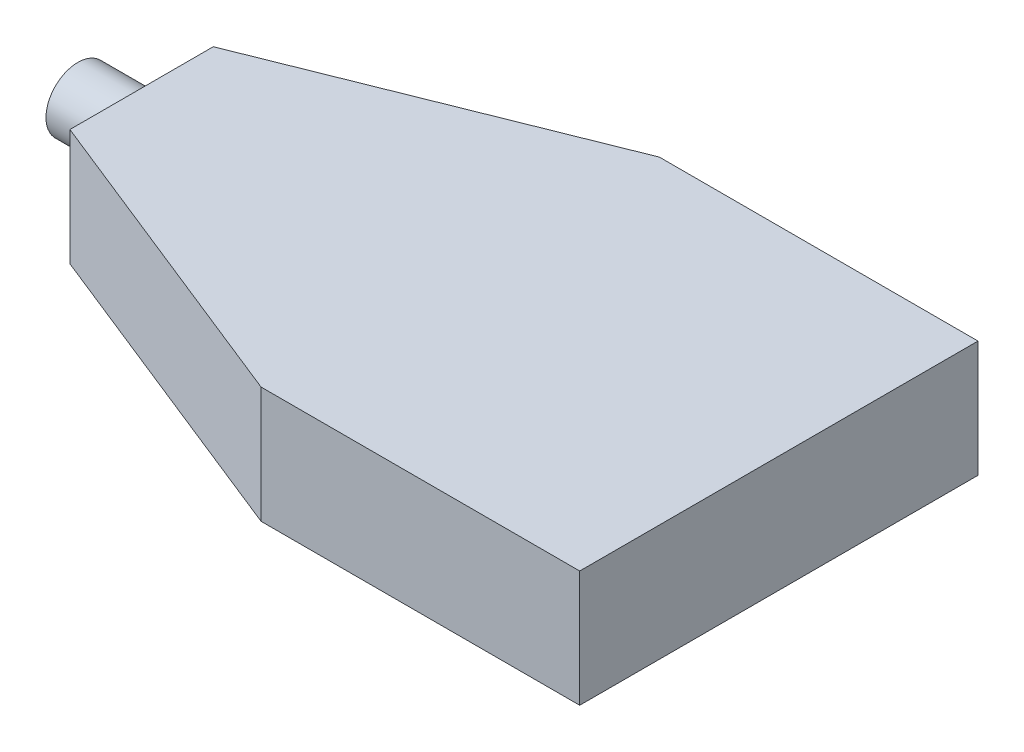
ISO-10303-21;
HEADER;
FILE_DESCRIPTION(('STEP AP214'),'2;1');
FILE_NAME('part.step','',(''),(''),'','','');
FILE_SCHEMA(('AUTOMOTIVE_DESIGN { 1 0 10303 214 1 1 1 1 }'));
ENDSEC;
DATA;
#1=APPLICATION_CONTEXT('core data for automotive mechanical design processes');
#2=APPLICATION_PROTOCOL_DEFINITION('international standard','automotive_design',2000,#1);
#3=PRODUCT_CONTEXT('',#1,'mechanical');
#4=PRODUCT('Part','Part','',(#3));
#5=PRODUCT_RELATED_PRODUCT_CATEGORY('part','',(#4));
#6=PRODUCT_DEFINITION_FORMATION('','',#4);
#7=PRODUCT_DEFINITION_CONTEXT('part definition',#1,'design');
#8=PRODUCT_DEFINITION('design','',#6,#7);
#9=PRODUCT_DEFINITION_SHAPE('','',#8);
#10=(LENGTH_UNIT() NAMED_UNIT(*) SI_UNIT(.MILLI.,.METRE.));
#11=(NAMED_UNIT(*) PLANE_ANGLE_UNIT() SI_UNIT($,.RADIAN.));
#12=(NAMED_UNIT(*) SI_UNIT($,.STERADIAN.) SOLID_ANGLE_UNIT());
#13=UNCERTAINTY_MEASURE_WITH_UNIT(LENGTH_MEASURE(1.E-05),#10,'distance_accuracy_value','');
#14=(GEOMETRIC_REPRESENTATION_CONTEXT(3) GLOBAL_UNCERTAINTY_ASSIGNED_CONTEXT((#13)) GLOBAL_UNIT_ASSIGNED_CONTEXT((#10,
#11,#12)) REPRESENTATION_CONTEXT('',''));
#15=CARTESIAN_POINT('',(0.,0.,0.));
#16=DIRECTION('',(0.,0.,1.));
#17=DIRECTION('',(1.,0.,0.));
#18=AXIS2_PLACEMENT_3D('',#15,#16,#17);
#19=CARTESIAN_POINT('',(-150.,36.5,0.));
#20=DIRECTION('',(1.,0.,0.));
#21=DIRECTION('',(0.,0.,-1.));
#22=AXIS2_PLACEMENT_3D('',#19,#20,#21);
#23=PLANE('',#22);
#24=CARTESIAN_POINT('',(-150.,23.5,0.));
#25=DIRECTION('',(-1.,0.,0.));
#26=DIRECTION('',(0.,0.,1.));
#27=AXIS2_PLACEMENT_3D('',#24,#25,#26);
#28=CIRCLE('',#27,10.);
#29=CARTESIAN_POINT('',(-150.,23.5,10.));
#30=VERTEX_POINT('',#29);
#31=EDGE_CURVE('E11',#30,#30,#28,.T.);
#32=ORIENTED_EDGE('',*,*,#31,.F.);
#33=EDGE_LOOP('',(#32));
#34=FACE_BOUND('',#33,.T.);
#35=DIRECTION('',(0.,0.,1.));
#36=VECTOR('',#35,1.);
#37=CARTESIAN_POINT('',(-150.,0.,0.));
#38=LINE('',#37,#36);
#39=CARTESIAN_POINT('',(-150.,0.,-22.5));
#40=VERTEX_POINT('',#39);
#41=CARTESIAN_POINT('',(-150.,0.,22.5));
#42=VERTEX_POINT('',#41);
#43=EDGE_CURVE('E127',#40,#42,#38,.T.);
#44=ORIENTED_EDGE('',*,*,#43,.T.);
#45=DIRECTION('',(0.,-1.,0.));
#46=VECTOR('',#45,1.);
#47=CARTESIAN_POINT('',(-150.,36.5,22.5));
#48=LINE('',#47,#46);
#49=CARTESIAN_POINT('',(-150.,36.5,22.5));
#50=VERTEX_POINT('',#49);
#51=EDGE_CURVE('E43',#50,#42,#48,.T.);
#52=ORIENTED_EDGE('',*,*,#51,.F.);
#53=DIRECTION('',(0.,0.,1.));
#54=VECTOR('',#53,1.);
#55=CARTESIAN_POINT('',(-150.,36.5,0.));
#56=LINE('',#55,#54);
#57=CARTESIAN_POINT('',(-150.,36.5,-22.5));
#58=VERTEX_POINT('',#57);
#59=EDGE_CURVE('E140',#58,#50,#56,.T.);
#60=ORIENTED_EDGE('',*,*,#59,.F.);
#61=DIRECTION('',(0.,-1.,0.));
#62=VECTOR('',#61,1.);
#63=CARTESIAN_POINT('',(-150.,36.5,-22.5));
#64=LINE('',#63,#62);
#65=EDGE_CURVE('E57',#58,#40,#64,.T.);
#66=ORIENTED_EDGE('',*,*,#65,.T.);
#67=EDGE_LOOP('',(#44,#52,#60,#66));
#68=FACE_BOUND('',#67,.T.);
#69=ADVANCED_FACE('F40',(#34,#68),#23,.F.);
#70=CARTESIAN_POINT('',(-28.4482758620689,36.5,71.1206896551724));
#71=DIRECTION('',(0.371390676354103,0.,-0.92847669088526));
#72=DIRECTION('',(-0.92847669088526,0.,-0.371390676354103));
#73=AXIS2_PLACEMENT_3D('',#70,#71,#72);
#74=PLANE('',#73);
#75=DIRECTION('',(0.92847669088526,0.,0.371390676354103));
#76=VECTOR('',#75,1.);
#77=CARTESIAN_POINT('',(-28.4482758620689,0.,71.1206896551724));
#78=LINE('',#77,#76);
#79=CARTESIAN_POINT('',(-50.,0.,62.5));
#80=VERTEX_POINT('',#79);
#81=EDGE_CURVE('E129',#42,#80,#78,.T.);
#82=ORIENTED_EDGE('',*,*,#81,.T.);
#83=DIRECTION('',(0.,-1.,0.));
#84=VECTOR('',#83,1.);
#85=CARTESIAN_POINT('',(-50.,36.5,62.5));
#86=LINE('',#85,#84);
#87=CARTESIAN_POINT('',(-50.,36.5,62.5));
#88=VERTEX_POINT('',#87);
#89=EDGE_CURVE('E143',#88,#80,#86,.T.);
#90=ORIENTED_EDGE('',*,*,#89,.F.);
#91=DIRECTION('',(0.92847669088526,0.,0.371390676354103));
#92=VECTOR('',#91,1.);
#93=CARTESIAN_POINT('',(-28.4482758620689,36.5,71.1206896551724));
#94=LINE('',#93,#92);
#95=EDGE_CURVE('E90',#50,#88,#94,.T.);
#96=ORIENTED_EDGE('',*,*,#95,.F.);
#97=ORIENTED_EDGE('',*,*,#51,.T.);
#98=EDGE_LOOP('',(#82,#90,#96,#97));
#99=FACE_BOUND('',#98,.T.);
#100=ADVANCED_FACE('F148',(#99),#74,.F.);
#101=CARTESIAN_POINT('',(0.,36.5,62.5));
#102=DIRECTION('',(0.,0.,-1.));
#103=DIRECTION('',(-1.,0.,0.));
#104=AXIS2_PLACEMENT_3D('',#101,#102,#103);
#105=PLANE('',#104);
#106=DIRECTION('',(1.,0.,0.));
#107=VECTOR('',#106,1.);
#108=CARTESIAN_POINT('',(0.,0.,62.5));
#109=LINE('',#108,#107);
#110=CARTESIAN_POINT('',(50.,0.,62.5));
#111=VERTEX_POINT('',#110);
#112=EDGE_CURVE('E132',#80,#111,#109,.T.);
#113=ORIENTED_EDGE('',*,*,#112,.T.);
#114=DIRECTION('',(0.,-1.,0.));
#115=VECTOR('',#114,1.);
#116=CARTESIAN_POINT('',(50.,36.5,62.5));
#117=LINE('',#116,#115);
#118=CARTESIAN_POINT('',(50.,36.5,62.5));
#119=VERTEX_POINT('',#118);
#120=EDGE_CURVE('E119',#119,#111,#117,.T.);
#121=ORIENTED_EDGE('',*,*,#120,.F.);
#122=DIRECTION('',(1.,0.,0.));
#123=VECTOR('',#122,1.);
#124=CARTESIAN_POINT('',(0.,36.5,62.5));
#125=LINE('',#124,#123);
#126=EDGE_CURVE('E107',#88,#119,#125,.T.);
#127=ORIENTED_EDGE('',*,*,#126,.F.);
#128=ORIENTED_EDGE('',*,*,#89,.T.);
#129=EDGE_LOOP('',(#113,#121,#127,#128));
#130=FACE_BOUND('',#129,.T.);
#131=ADVANCED_FACE('F166',(#130),#105,.F.);
#132=CARTESIAN_POINT('',(50.,36.5,0.));
#133=DIRECTION('',(-1.,0.,0.));
#134=DIRECTION('',(0.,0.,1.));
#135=AXIS2_PLACEMENT_3D('',#132,#133,#134);
#136=PLANE('',#135);
#137=DIRECTION('',(0.,0.,-1.));
#138=VECTOR('',#137,1.);
#139=CARTESIAN_POINT('',(50.,0.,0.));
#140=LINE('',#139,#138);
#141=CARTESIAN_POINT('',(50.,0.,-62.5));
#142=VERTEX_POINT('',#141);
#143=EDGE_CURVE('E116',#111,#142,#140,.T.);
#144=ORIENTED_EDGE('',*,*,#143,.T.);
#145=DIRECTION('',(0.,-1.,0.));
#146=VECTOR('',#145,1.);
#147=CARTESIAN_POINT('',(50.,36.5,-62.5));
#148=LINE('',#147,#146);
#149=CARTESIAN_POINT('',(50.,36.5,-62.5));
#150=VERTEX_POINT('',#149);
#151=EDGE_CURVE('E113',#150,#142,#148,.T.);
#152=ORIENTED_EDGE('',*,*,#151,.F.);
#153=DIRECTION('',(0.,0.,-1.));
#154=VECTOR('',#153,1.);
#155=CARTESIAN_POINT('',(50.,36.5,0.));
#156=LINE('',#155,#154);
#157=EDGE_CURVE('E100',#119,#150,#156,.T.);
#158=ORIENTED_EDGE('',*,*,#157,.F.);
#159=ORIENTED_EDGE('',*,*,#120,.T.);
#160=EDGE_LOOP('',(#144,#152,#158,#159));
#161=FACE_BOUND('',#160,.T.);
#162=ADVANCED_FACE('F114',(#161),#136,.F.);
#163=CARTESIAN_POINT('',(0.,36.5,-62.5));
#164=DIRECTION('',(0.,0.,-1.));
#165=DIRECTION('',(-1.,0.,0.));
#166=AXIS2_PLACEMENT_3D('',#163,#164,#165);
#167=PLANE('',#166);
#168=DIRECTION('',(1.,0.,0.));
#169=VECTOR('',#168,1.);
#170=CARTESIAN_POINT('',(0.,0.,-62.5));
#171=LINE('',#170,#169);
#172=CARTESIAN_POINT('',(-50.,0.,-62.5));
#173=VERTEX_POINT('',#172);
#174=EDGE_CURVE('E135',#173,#142,#171,.T.);
#175=ORIENTED_EDGE('',*,*,#174,.F.);
#176=DIRECTION('',(0.,-1.,0.));
#177=VECTOR('',#176,1.);
#178=CARTESIAN_POINT('',(-50.,36.5,-62.5));
#179=LINE('',#178,#177);
#180=CARTESIAN_POINT('',(-50.,36.5,-62.5));
#181=VERTEX_POINT('',#180);
#182=EDGE_CURVE('E77',#181,#173,#179,.T.);
#183=ORIENTED_EDGE('',*,*,#182,.F.);
#184=DIRECTION('',(1.,0.,0.));
#185=VECTOR('',#184,1.);
#186=CARTESIAN_POINT('',(0.,36.5,-62.5));
#187=LINE('',#186,#185);
#188=EDGE_CURVE('E105',#181,#150,#187,.T.);
#189=ORIENTED_EDGE('',*,*,#188,.T.);
#190=ORIENTED_EDGE('',*,*,#151,.T.);
#191=EDGE_LOOP('',(#175,#183,#189,#190));
#192=FACE_BOUND('',#191,.T.);
#193=ADVANCED_FACE('F121',(#192),#167,.T.);
#194=CARTESIAN_POINT('',(-28.448275862069,36.5,-71.1206896551724));
#195=DIRECTION('',(-0.371390676354104,0.,-0.928476690885259));
#196=DIRECTION('',(-0.928476690885259,0.,0.371390676354104));
#197=AXIS2_PLACEMENT_3D('',#194,#195,#196);
#198=PLANE('',#197);
#199=DIRECTION('',(0.928476690885259,0.,-0.371390676354104));
#200=VECTOR('',#199,1.);
#201=CARTESIAN_POINT('',(-28.448275862069,0.,-71.1206896551724));
#202=LINE('',#201,#200);
#203=EDGE_CURVE('E137',#40,#173,#202,.T.);
#204=ORIENTED_EDGE('',*,*,#203,.F.);
#205=ORIENTED_EDGE('',*,*,#65,.F.);
#206=DIRECTION('',(0.928476690885259,0.,-0.371390676354104));
#207=VECTOR('',#206,1.);
#208=CARTESIAN_POINT('',(-28.448275862069,36.5,-71.1206896551724));
#209=LINE('',#208,#207);
#210=EDGE_CURVE('E122',#58,#181,#209,.T.);
#211=ORIENTED_EDGE('',*,*,#210,.T.);
#212=ORIENTED_EDGE('',*,*,#182,.T.);
#213=EDGE_LOOP('',(#204,#205,#211,#212));
#214=FACE_BOUND('',#213,.T.);
#215=ADVANCED_FACE('F151',(#214),#198,.T.);
#216=CARTESIAN_POINT('',(0.,36.5,0.));
#217=DIRECTION('',(0.,1.,0.));
#218=DIRECTION('',(0.,0.,1.));
#219=AXIS2_PLACEMENT_3D('',#216,#217,#218);
#220=PLANE('',#219);
#221=ORIENTED_EDGE('',*,*,#59,.T.);
#222=ORIENTED_EDGE('',*,*,#95,.T.);
#223=ORIENTED_EDGE('',*,*,#126,.T.);
#224=ORIENTED_EDGE('',*,*,#157,.T.);
#225=ORIENTED_EDGE('',*,*,#188,.F.);
#226=ORIENTED_EDGE('',*,*,#210,.F.);
#227=EDGE_LOOP('',(#221,#222,#223,#224,#225,#226));
#228=FACE_BOUND('',#227,.T.);
#229=ADVANCED_FACE('F102',(#228),#220,.T.);
#230=CARTESIAN_POINT('',(0.,0.,0.));
#231=DIRECTION('',(0.,1.,0.));
#232=DIRECTION('',(0.,0.,1.));
#233=AXIS2_PLACEMENT_3D('',#230,#231,#232);
#234=PLANE('',#233);
#235=ORIENTED_EDGE('',*,*,#43,.F.);
#236=ORIENTED_EDGE('',*,*,#203,.T.);
#237=ORIENTED_EDGE('',*,*,#174,.T.);
#238=ORIENTED_EDGE('',*,*,#143,.F.);
#239=ORIENTED_EDGE('',*,*,#112,.F.);
#240=ORIENTED_EDGE('',*,*,#81,.F.);
#241=EDGE_LOOP('',(#235,#236,#237,#238,#239,#240));
#242=FACE_BOUND('',#241,.T.);
#243=ADVANCED_FACE('F150',(#242),#234,.F.);
#244=CARTESIAN_POINT('',(-170.,23.5,0.));
#245=DIRECTION('',(1.,0.,0.));
#246=DIRECTION('',(0.,0.,-1.));
#247=AXIS2_PLACEMENT_3D('',#244,#245,#246);
#248=CYLINDRICAL_SURFACE('',#247,10.);
#249=CARTESIAN_POINT('',(-170.,23.5,0.));
#250=DIRECTION('',(-1.,0.,0.));
#251=DIRECTION('',(0.,0.,1.));
#252=AXIS2_PLACEMENT_3D('',#249,#250,#251);
#253=CIRCLE('',#252,10.);
#254=CARTESIAN_POINT('',(-170.,23.5,10.));
#255=VERTEX_POINT('',#254);
#256=EDGE_CURVE('E130',#255,#255,#253,.T.);
#257=ORIENTED_EDGE('',*,*,#256,.F.);
#258=EDGE_LOOP('',(#257));
#259=FACE_BOUND('',#258,.T.);
#260=ORIENTED_EDGE('',*,*,#31,.T.);
#261=EDGE_LOOP('',(#260));
#262=FACE_BOUND('',#261,.T.);
#263=ADVANCED_FACE('F169',(#259,#262),#248,.T.);
#264=CARTESIAN_POINT('',(-170.,0.,1.00763370786697E-13));
#265=DIRECTION('',(-1.,0.,0.));
#266=DIRECTION('',(0.,0.,1.));
#267=AXIS2_PLACEMENT_3D('',#264,#265,#266);
#268=PLANE('',#267);
#269=CARTESIAN_POINT('',(-170.,23.5,1.07812531475897E-13));
#270=DIRECTION('',(-1.,0.,0.));
#271=DIRECTION('',(0.,0.,1.));
#272=AXIS2_PLACEMENT_3D('',#269,#270,#271);
#273=CIRCLE('',#272,9.1);
#274=CARTESIAN_POINT('',(-170.,23.5,9.10000000000011));
#275=VERTEX_POINT('',#274);
#276=EDGE_CURVE('E194',#275,#275,#273,.T.);
#277=ORIENTED_EDGE('',*,*,#276,.F.);
#278=EDGE_LOOP('',(#277));
#279=FACE_BOUND('',#278,.T.);
#280=ORIENTED_EDGE('',*,*,#256,.T.);
#281=EDGE_LOOP('',(#280));
#282=FACE_BOUND('',#281,.T.);
#283=ADVANCED_FACE('F171',(#279,#282),#268,.T.);
#284=CARTESIAN_POINT('',(-150.,23.5,0.));
#285=DIRECTION('',(-1.,0.,0.));
#286=DIRECTION('',(0.,0.,1.));
#287=AXIS2_PLACEMENT_3D('',#284,#285,#286);
#288=CYLINDRICAL_SURFACE('',#287,9.1);
#289=CARTESIAN_POINT('',(-150.,23.5,0.));
#290=DIRECTION('',(-1.,0.,0.));
#291=DIRECTION('',(0.,0.,1.));
#292=AXIS2_PLACEMENT_3D('',#289,#290,#291);
#293=CIRCLE('',#292,9.1);
#294=CARTESIAN_POINT('',(-150.,23.5,9.1000000000001));
#295=VERTEX_POINT('',#294);
#296=EDGE_CURVE('E193',#295,#295,#293,.T.);
#297=ORIENTED_EDGE('',*,*,#296,.F.);
#298=EDGE_LOOP('',(#297));
#299=FACE_BOUND('',#298,.T.);
#300=ORIENTED_EDGE('',*,*,#276,.T.);
#301=EDGE_LOOP('',(#300));
#302=FACE_BOUND('',#301,.T.);
#303=ADVANCED_FACE('F178',(#299,#302),#288,.F.);
#304=CARTESIAN_POINT('',(-150.,23.5,0.));
#305=DIRECTION('',(-1.,0.,0.));
#306=DIRECTION('',(0.,0.,1.));
#307=AXIS2_PLACEMENT_3D('',#304,#305,#306);
#308=PLANE('',#307);
#309=ORIENTED_EDGE('',*,*,#296,.T.);
#310=EDGE_LOOP('',(#309));
#311=FACE_BOUND('',#310,.T.);
#312=ADVANCED_FACE('F185',(#311),#308,.T.);
#313=CLOSED_SHELL('',(#69,#100,#131,#162,#193,#215,#229,#243,#263,#283,#303,#312));
#314=MANIFOLD_SOLID_BREP('B2',#313);
#315=ADVANCED_BREP_SHAPE_REPRESENTATION('',(#18,#314),#14);
#316=SHAPE_DEFINITION_REPRESENTATION(#9,#315);
ENDSEC;
END-ISO-10303-21;
